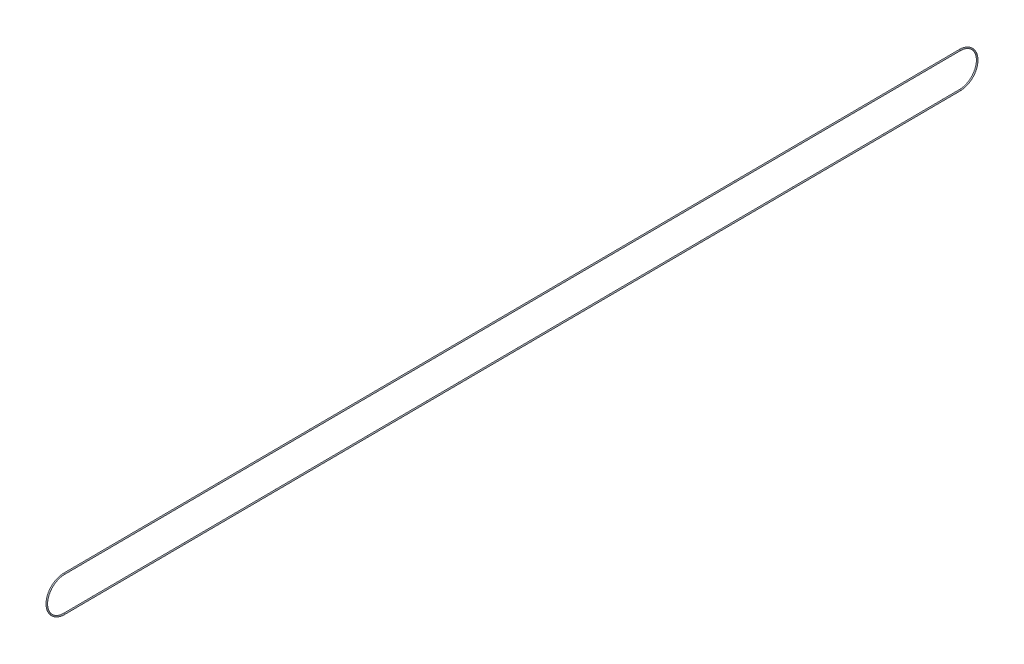
ISO-10303-21;
HEADER;
FILE_DESCRIPTION(('STEP AP214'),'2;1');
FILE_NAME('part.step','',(''),(''),'','','');
FILE_SCHEMA(('AUTOMOTIVE_DESIGN { 1 0 10303 214 1 1 1 1 }'));
ENDSEC;
DATA;
#1=APPLICATION_CONTEXT('core data for automotive mechanical design processes');
#2=APPLICATION_PROTOCOL_DEFINITION('international standard','automotive_design',2000,#1);
#3=PRODUCT_CONTEXT('',#1,'mechanical');
#4=PRODUCT('Part','Part','',(#3));
#5=PRODUCT_RELATED_PRODUCT_CATEGORY('part','',(#4));
#6=PRODUCT_DEFINITION_FORMATION('','',#4);
#7=PRODUCT_DEFINITION_CONTEXT('part definition',#1,'design');
#8=PRODUCT_DEFINITION('design','',#6,#7);
#9=PRODUCT_DEFINITION_SHAPE('','',#8);
#10=(LENGTH_UNIT() NAMED_UNIT(*) SI_UNIT(.MILLI.,.METRE.));
#11=(NAMED_UNIT(*) PLANE_ANGLE_UNIT() SI_UNIT($,.RADIAN.));
#12=(NAMED_UNIT(*) SI_UNIT($,.STERADIAN.) SOLID_ANGLE_UNIT());
#13=UNCERTAINTY_MEASURE_WITH_UNIT(LENGTH_MEASURE(1.E-05),#10,'distance_accuracy_value','');
#14=(GEOMETRIC_REPRESENTATION_CONTEXT(3) GLOBAL_UNCERTAINTY_ASSIGNED_CONTEXT((#13)) GLOBAL_UNIT_ASSIGNED_CONTEXT((#10,
#11,#12)) REPRESENTATION_CONTEXT('',''));
#15=CARTESIAN_POINT('',(0.,0.,0.));
#16=DIRECTION('',(0.,0.,1.));
#17=DIRECTION('',(1.,0.,0.));
#18=AXIS2_PLACEMENT_3D('',#15,#16,#17);
#19=CARTESIAN_POINT('',(0.,3.69426751592388,-580.));
#20=DIRECTION('',(1.,0.,0.));
#21=DIRECTION('',(0.,0.,-1.));
#22=AXIS2_PLACEMENT_3D('',#19,#20,#21);
#23=TOROIDAL_SURFACE('',#22,22.5,0.75);
#24=CARTESIAN_POINT('',(0.,-18.8052760899948,-580.143309194942));
#25=DIRECTION('',(0.,0.00636929755298645,-0.999979715818617));
#26=DIRECTION('',(0.,0.999979715818617,0.00636929755298645));
#27=AXIS2_PLACEMENT_3D('',#24,#25,#26);
#28=CIRCLE('',#27,0.75);
#29=CARTESIAN_POINT('',(0.,-19.555260876859,-580.148086168107));
#30=VERTEX_POINT('',#29);
#31=EDGE_CURVE('E11',#30,#30,#28,.T.);
#32=CARTESIAN_POINT('',(0.,26.193811121843,-579.856690805058));
#33=DIRECTION('',(0.,-0.00636929755298645,0.999979715818617));
#34=DIRECTION('',(0.,-0.999979715818617,-0.00636929755298645));
#35=AXIS2_PLACEMENT_3D('',#32,#33,#34);
#36=CIRCLE('',#35,0.75);
#37=CARTESIAN_POINT('',(0.,26.9437959087067,-579.851913831893));
#38=VERTEX_POINT('',#37);
#39=EDGE_CURVE('E66',#38,#38,#36,.T.);
#40=CARTESIAN_POINT('',(0.,3.69426751592388,-580.));
#41=DIRECTION('',(1.,0.,0.));
#42=DIRECTION('',(0.,0.,-1.));
#43=AXIS2_PLACEMENT_3D('',#40,#41,#42);
#44=CIRCLE('',#43,23.25);
#45=EDGE_CURVE('',#30,#38,#44,.T.);
#46=ORIENTED_EDGE('',*,*,#31,.T.);
#47=ORIENTED_EDGE('',*,*,#39,.F.);
#48=ORIENTED_EDGE('',*,*,#45,.T.);
#49=ORIENTED_EDGE('',*,*,#45,.F.);
#50=EDGE_LOOP('',(#46,#48,#47,#49));
#51=FACE_BOUND('',#50,.T.);
#52=ADVANCED_FACE('F49',(#51),#23,.T.);
#53=CARTESIAN_POINT('',(0.,-26.193811121843,579.856690805058));
#54=DIRECTION('',(0.,0.00636929755298537,-0.999979715818617));
#55=DIRECTION('',(0.,0.999979715818617,0.00636929755298537));
#56=AXIS2_PLACEMENT_3D('',#53,#54,#55);
#57=CYLINDRICAL_SURFACE('',#56,0.75);
#58=ORIENTED_EDGE('',*,*,#31,.F.);
#59=EDGE_LOOP('',(#58));
#60=FACE_BOUND('',#59,.T.);
#61=CARTESIAN_POINT('',(0.,-26.1938111218411,579.856690805058));
#62=DIRECTION('',(0.,0.00636929755298324,-0.999979715818617));
#63=DIRECTION('',(0.,0.999979715818617,0.00636929755298324));
#64=AXIS2_PLACEMENT_3D('',#61,#62,#63);
#65=CIRCLE('',#64,0.75);
#66=CARTESIAN_POINT('',(0.,-26.9437959087055,579.851913831894));
#67=VERTEX_POINT('',#66);
#68=EDGE_CURVE('E56',#67,#67,#65,.T.);
#69=ORIENTED_EDGE('',*,*,#68,.T.);
#70=EDGE_LOOP('',(#69));
#71=FACE_BOUND('',#70,.T.);
#72=ADVANCED_FACE('F76',(#60,#71),#57,.T.);
#73=CARTESIAN_POINT('',(0.,-3.69426751592367,580.));
#74=DIRECTION('',(1.,0.,0.));
#75=DIRECTION('',(0.,0.,-1.));
#76=AXIS2_PLACEMENT_3D('',#73,#74,#75);
#77=TOROIDAL_SURFACE('',#76,22.499999999999,0.75);
#78=CARTESIAN_POINT('',(0.,18.8052760899952,580.143309194942));
#79=DIRECTION('',(0.,-0.00636929755298645,0.999979715818617));
#80=DIRECTION('',(0.,-0.999979715818617,-0.00636929755298645));
#81=AXIS2_PLACEMENT_3D('',#78,#79,#80);
#82=CIRCLE('',#81,0.75);
#83=CARTESIAN_POINT('',(0.,19.5552608768582,580.148086168107));
#84=VERTEX_POINT('',#83);
#85=EDGE_CURVE('E61',#84,#84,#82,.T.);
#86=CARTESIAN_POINT('',(0.,-3.69426751592367,580.));
#87=DIRECTION('',(1.,0.,0.));
#88=DIRECTION('',(0.,0.,-1.));
#89=AXIS2_PLACEMENT_3D('',#86,#87,#88);
#90=CIRCLE('',#89,23.249999999999);
#91=EDGE_CURVE('',#84,#67,#90,.T.);
#92=ORIENTED_EDGE('',*,*,#85,.T.);
#93=ORIENTED_EDGE('',*,*,#68,.F.);
#94=ORIENTED_EDGE('',*,*,#91,.T.);
#95=ORIENTED_EDGE('',*,*,#91,.F.);
#96=EDGE_LOOP('',(#92,#94,#93,#95));
#97=FACE_BOUND('',#96,.T.);
#98=ADVANCED_FACE('F80',(#97),#77,.T.);
#99=CARTESIAN_POINT('',(0.,26.193811121843,-579.856690805058));
#100=DIRECTION('',(0.,-0.00636929755298537,0.999979715818617));
#101=DIRECTION('',(0.,-0.999979715818617,-0.00636929755298537));
#102=AXIS2_PLACEMENT_3D('',#99,#100,#101);
#103=CYLINDRICAL_SURFACE('',#102,0.75);
#104=ORIENTED_EDGE('',*,*,#85,.F.);
#105=EDGE_LOOP('',(#104));
#106=FACE_BOUND('',#105,.T.);
#107=ORIENTED_EDGE('',*,*,#39,.T.);
#108=EDGE_LOOP('',(#107));
#109=FACE_BOUND('',#108,.T.);
#110=ADVANCED_FACE('F73',(#106,#109),#103,.T.);
#111=CLOSED_SHELL('',(#52,#72,#98,#110));
#112=MANIFOLD_SOLID_BREP('B2',#111);
#113=ADVANCED_BREP_SHAPE_REPRESENTATION('',(#18,#112),#14);
#114=SHAPE_DEFINITION_REPRESENTATION(#9,#113);
ENDSEC;
END-ISO-10303-21;
